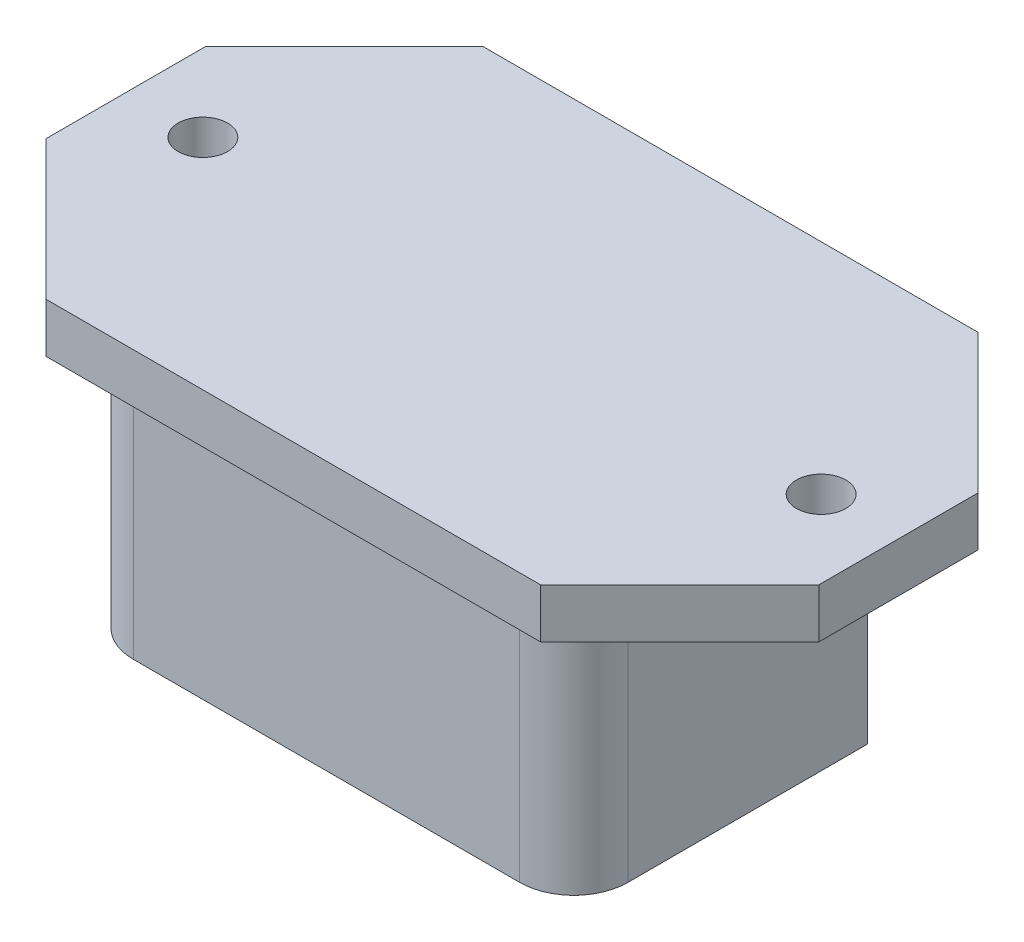
ISO-10303-21;
HEADER;
FILE_DESCRIPTION(('STEP AP214'),'2;1');
FILE_NAME('part.step','',(''),(''),'','','');
FILE_SCHEMA(('AUTOMOTIVE_DESIGN { 1 0 10303 214 1 1 1 1 }'));
ENDSEC;
DATA;
#1=APPLICATION_CONTEXT('core data for automotive mechanical design processes');
#2=APPLICATION_PROTOCOL_DEFINITION('international standard','automotive_design',2000,#1);
#3=PRODUCT_CONTEXT('',#1,'mechanical');
#4=PRODUCT('Part','Part','',(#3));
#5=PRODUCT_RELATED_PRODUCT_CATEGORY('part','',(#4));
#6=PRODUCT_DEFINITION_FORMATION('','',#4);
#7=PRODUCT_DEFINITION_CONTEXT('part definition',#1,'design');
#8=PRODUCT_DEFINITION('design','',#6,#7);
#9=PRODUCT_DEFINITION_SHAPE('','',#8);
#10=(LENGTH_UNIT() NAMED_UNIT(*) SI_UNIT(.MILLI.,.METRE.));
#11=(NAMED_UNIT(*) PLANE_ANGLE_UNIT() SI_UNIT($,.RADIAN.));
#12=(NAMED_UNIT(*) SI_UNIT($,.STERADIAN.) SOLID_ANGLE_UNIT());
#13=UNCERTAINTY_MEASURE_WITH_UNIT(LENGTH_MEASURE(1.E-05),#10,'distance_accuracy_value','');
#14=(GEOMETRIC_REPRESENTATION_CONTEXT(3) GLOBAL_UNCERTAINTY_ASSIGNED_CONTEXT((#13)) GLOBAL_UNIT_ASSIGNED_CONTEXT((#10,
#11,#12)) REPRESENTATION_CONTEXT('',''));
#15=CARTESIAN_POINT('',(0.,0.,0.));
#16=DIRECTION('',(0.,0.,1.));
#17=DIRECTION('',(1.,0.,0.));
#18=AXIS2_PLACEMENT_3D('',#15,#16,#17);
#19=CARTESIAN_POINT('',(16.,16.3,12.));
#20=DIRECTION('',(-1.,0.,0.));
#21=DIRECTION('',(0.,0.,1.));
#22=AXIS2_PLACEMENT_3D('',#19,#20,#21);
#23=PLANE('',#22);
#24=DIRECTION('',(0.,0.,-1.));
#25=VECTOR('',#24,1.);
#26=CARTESIAN_POINT('',(16.,0.,12.));
#27=LINE('',#26,#25);
#28=CARTESIAN_POINT('',(16.,0.,8.5));
#29=VERTEX_POINT('',#28);
#30=CARTESIAN_POINT('',(16.,0.,-6.99999999999998));
#31=VERTEX_POINT('',#30);
#32=EDGE_CURVE('E269',#29,#31,#27,.T.);
#33=ORIENTED_EDGE('',*,*,#32,.T.);
#34=DIRECTION('',(0.,1.,0.));
#35=VECTOR('',#34,1.);
#36=CARTESIAN_POINT('',(16.,16.3,-6.99999999999998));
#37=LINE('',#36,#35);
#38=CARTESIAN_POINT('',(16.,16.3,-6.99999999999998));
#39=VERTEX_POINT('',#38);
#40=EDGE_CURVE('E205',#31,#39,#37,.T.);
#41=ORIENTED_EDGE('',*,*,#40,.T.);
#42=DIRECTION('',(0.,0.,-1.));
#43=VECTOR('',#42,1.);
#44=CARTESIAN_POINT('',(16.,16.3,12.));
#45=LINE('',#44,#43);
#46=CARTESIAN_POINT('',(16.,16.3,8.5));
#47=VERTEX_POINT('',#46);
#48=EDGE_CURVE('E173',#47,#39,#45,.T.);
#49=ORIENTED_EDGE('',*,*,#48,.F.);
#50=DIRECTION('',(0.,-1.,0.));
#51=VECTOR('',#50,1.);
#52=CARTESIAN_POINT('',(16.,16.3,8.5));
#53=LINE('',#52,#51);
#54=EDGE_CURVE('E186',#47,#29,#53,.T.);
#55=ORIENTED_EDGE('',*,*,#54,.T.);
#56=EDGE_LOOP('',(#33,#41,#49,#55));
#57=FACE_BOUND('',#56,.T.);
#58=ADVANCED_FACE('F35',(#57),#23,.F.);
#59=CARTESIAN_POINT('',(-16.,16.3,-12.));
#60=DIRECTION('',(0.,0.,1.));
#61=DIRECTION('',(1.,0.,0.));
#62=AXIS2_PLACEMENT_3D('',#59,#60,#61);
#63=PLANE('',#62);
#64=DIRECTION('',(-1.,0.,0.));
#65=VECTOR('',#64,1.);
#66=CARTESIAN_POINT('',(-16.,0.,-12.));
#67=LINE('',#66,#65);
#68=CARTESIAN_POINT('',(11.,0.,-12.));
#69=VERTEX_POINT('',#68);
#70=CARTESIAN_POINT('',(-11.,0.,-12.));
#71=VERTEX_POINT('',#70);
#72=EDGE_CURVE('E179',#69,#71,#67,.T.);
#73=ORIENTED_EDGE('',*,*,#72,.T.);
#74=DIRECTION('',(0.,1.,0.));
#75=VECTOR('',#74,1.);
#76=CARTESIAN_POINT('',(-11.,16.3,-12.));
#77=LINE('',#76,#75);
#78=CARTESIAN_POINT('',(-11.,16.3,-12.));
#79=VERTEX_POINT('',#78);
#80=EDGE_CURVE('E203',#71,#79,#77,.T.);
#81=ORIENTED_EDGE('',*,*,#80,.T.);
#82=DIRECTION('',(-1.,0.,0.));
#83=VECTOR('',#82,1.);
#84=CARTESIAN_POINT('',(-16.,16.3,-12.));
#85=LINE('',#84,#83);
#86=CARTESIAN_POINT('',(11.,16.3,-12.));
#87=VERTEX_POINT('',#86);
#88=EDGE_CURVE('E177',#87,#79,#85,.T.);
#89=ORIENTED_EDGE('',*,*,#88,.F.);
#90=DIRECTION('',(0.,-1.,0.));
#91=VECTOR('',#90,1.);
#92=CARTESIAN_POINT('',(11.,16.3,-12.));
#93=LINE('',#92,#91);
#94=EDGE_CURVE('E200',#87,#69,#93,.T.);
#95=ORIENTED_EDGE('',*,*,#94,.T.);
#96=EDGE_LOOP('',(#73,#81,#89,#95));
#97=FACE_BOUND('',#96,.T.);
#98=ADVANCED_FACE('F276',(#97),#63,.F.);
#99=CARTESIAN_POINT('',(-16.,16.3,12.));
#100=DIRECTION('',(1.,0.,0.));
#101=DIRECTION('',(0.,0.,-1.));
#102=AXIS2_PLACEMENT_3D('',#99,#100,#101);
#103=PLANE('',#102);
#104=DIRECTION('',(0.,0.,1.));
#105=VECTOR('',#104,1.);
#106=CARTESIAN_POINT('',(-16.,16.3,12.));
#107=LINE('',#106,#105);
#108=CARTESIAN_POINT('',(-16.,16.3,-7.));
#109=VERTEX_POINT('',#108);
#110=CARTESIAN_POINT('',(-16.,16.3,8.5));
#111=VERTEX_POINT('',#110);
#112=EDGE_CURVE('E266',#109,#111,#107,.T.);
#113=ORIENTED_EDGE('',*,*,#112,.F.);
#114=DIRECTION('',(0.,-1.,0.));
#115=VECTOR('',#114,1.);
#116=CARTESIAN_POINT('',(-16.,16.3,-7.));
#117=LINE('',#116,#115);
#118=CARTESIAN_POINT('',(-16.,0.,-7.));
#119=VERTEX_POINT('',#118);
#120=EDGE_CURVE('E193',#109,#119,#117,.T.);
#121=ORIENTED_EDGE('',*,*,#120,.T.);
#122=DIRECTION('',(0.,0.,1.));
#123=VECTOR('',#122,1.);
#124=CARTESIAN_POINT('',(-16.,0.,12.));
#125=LINE('',#124,#123);
#126=CARTESIAN_POINT('',(-16.,0.,8.5));
#127=VERTEX_POINT('',#126);
#128=EDGE_CURVE('E174',#119,#127,#125,.T.);
#129=ORIENTED_EDGE('',*,*,#128,.T.);
#130=DIRECTION('',(0.,-1.,0.));
#131=VECTOR('',#130,1.);
#132=CARTESIAN_POINT('',(-16.,16.3,8.5));
#133=LINE('',#132,#131);
#134=EDGE_CURVE('E155',#127,#111,#133,.F.);
#135=ORIENTED_EDGE('',*,*,#134,.T.);
#136=EDGE_LOOP('',(#113,#121,#129,#135));
#137=FACE_BOUND('',#136,.T.);
#138=ADVANCED_FACE('F285',(#137),#103,.F.);
#139=CARTESIAN_POINT('',(-16.,16.3,12.));
#140=DIRECTION('',(0.,0.,-1.));
#141=DIRECTION('',(-1.,0.,0.));
#142=AXIS2_PLACEMENT_3D('',#139,#140,#141);
#143=PLANE('',#142);
#144=DIRECTION('',(1.,0.,0.));
#145=VECTOR('',#144,1.);
#146=CARTESIAN_POINT('',(-16.,16.3,12.));
#147=LINE('',#146,#145);
#148=CARTESIAN_POINT('',(-12.5,16.3,12.));
#149=VERTEX_POINT('',#148);
#150=CARTESIAN_POINT('',(12.5,16.3,12.));
#151=VERTEX_POINT('',#150);
#152=EDGE_CURVE('E168',#149,#151,#147,.T.);
#153=ORIENTED_EDGE('',*,*,#152,.F.);
#154=DIRECTION('',(0.,-1.,0.));
#155=VECTOR('',#154,1.);
#156=CARTESIAN_POINT('',(-12.5,16.3,12.));
#157=LINE('',#156,#155);
#158=CARTESIAN_POINT('',(-12.5,0.,12.));
#159=VERTEX_POINT('',#158);
#160=EDGE_CURVE('E153',#149,#159,#157,.T.);
#161=ORIENTED_EDGE('',*,*,#160,.T.);
#162=DIRECTION('',(1.,0.,0.));
#163=VECTOR('',#162,1.);
#164=CARTESIAN_POINT('',(-16.,0.,12.));
#165=LINE('',#164,#163);
#166=CARTESIAN_POINT('',(12.5,0.,12.));
#167=VERTEX_POINT('',#166);
#168=EDGE_CURVE('E165',#159,#167,#165,.T.);
#169=ORIENTED_EDGE('',*,*,#168,.T.);
#170=DIRECTION('',(0.,-1.,0.));
#171=VECTOR('',#170,1.);
#172=CARTESIAN_POINT('',(12.5,16.3,12.));
#173=LINE('',#172,#171);
#174=EDGE_CURVE('E169',#167,#151,#173,.F.);
#175=ORIENTED_EDGE('',*,*,#174,.T.);
#176=EDGE_LOOP('',(#153,#161,#169,#175));
#177=FACE_BOUND('',#176,.T.);
#178=ADVANCED_FACE('F164',(#177),#143,.F.);
#179=CARTESIAN_POINT('',(0.,0.,0.));
#180=DIRECTION('',(0.,-1.,0.));
#181=DIRECTION('',(0.,0.,-1.));
#182=AXIS2_PLACEMENT_3D('',#179,#180,#181);
#183=PLANE('',#182);
#184=ORIENTED_EDGE('',*,*,#128,.F.);
#185=DIRECTION('',(-0.707106781186549,0.,0.707106781186546));
#186=VECTOR('',#185,1.);
#187=CARTESIAN_POINT('',(-11.5,0.,-11.5));
#188=LINE('',#187,#186);
#189=EDGE_CURVE('E198',#119,#71,#188,.F.);
#190=ORIENTED_EDGE('',*,*,#189,.T.);
#191=ORIENTED_EDGE('',*,*,#72,.F.);
#192=DIRECTION('',(-0.707106781186546,0.,-0.707106781186549));
#193=VECTOR('',#192,1.);
#194=CARTESIAN_POINT('',(11.5,0.,-11.5));
#195=LINE('',#194,#193);
#196=EDGE_CURVE('E196',#69,#31,#195,.F.);
#197=ORIENTED_EDGE('',*,*,#196,.T.);
#198=ORIENTED_EDGE('',*,*,#32,.F.);
#199=CARTESIAN_POINT('',(12.5,0.,8.5));
#200=DIRECTION('',(0.,-1.,0.));
#201=DIRECTION('',(0.,0.,-1.));
#202=AXIS2_PLACEMENT_3D('',#199,#200,#201);
#203=CIRCLE('',#202,3.5);
#204=EDGE_CURVE('E159',#29,#167,#203,.T.);
#205=ORIENTED_EDGE('',*,*,#204,.T.);
#206=ORIENTED_EDGE('',*,*,#168,.F.);
#207=CARTESIAN_POINT('',(-12.5,0.,8.5));
#208=DIRECTION('',(0.,-1.,0.));
#209=DIRECTION('',(0.,0.,-1.));
#210=AXIS2_PLACEMENT_3D('',#207,#208,#209);
#211=CIRCLE('',#210,3.5);
#212=EDGE_CURVE('E149',#159,#127,#211,.T.);
#213=ORIENTED_EDGE('',*,*,#212,.T.);
#214=EDGE_LOOP('',(#184,#190,#191,#197,#198,#205,#206,#213));
#215=FACE_BOUND('',#214,.T.);
#216=ADVANCED_FACE('F171',(#215),#183,.T.);
#217=CARTESIAN_POINT('',(0.,16.3,0.));
#218=DIRECTION('',(0.,1.,0.));
#219=DIRECTION('',(0.,0.,1.));
#220=AXIS2_PLACEMENT_3D('',#217,#218,#219);
#221=PLANE('',#220);
#222=CARTESIAN_POINT('',(-20.,16.3,0.));
#223=DIRECTION('',(0.,1.,0.));
#224=DIRECTION('',(0.,0.,1.));
#225=AXIS2_PLACEMENT_3D('',#222,#223,#224);
#226=CIRCLE('',#225,1.6);
#227=CARTESIAN_POINT('',(-20.,16.3,1.6));
#228=VERTEX_POINT('',#227);
#229=EDGE_CURVE('E484',#228,#228,#226,.T.);
#230=ORIENTED_EDGE('',*,*,#229,.T.);
#231=EDGE_LOOP('',(#230));
#232=FACE_BOUND('',#231,.T.);
#233=CARTESIAN_POINT('',(20.,16.3,0.));
#234=DIRECTION('',(0.,1.,0.));
#235=DIRECTION('',(0.,0.,-1.));
#236=AXIS2_PLACEMENT_3D('',#233,#234,#235);
#237=CIRCLE('',#236,1.6);
#238=CARTESIAN_POINT('',(20.,16.3,-1.60000000000001));
#239=VERTEX_POINT('',#238);
#240=EDGE_CURVE('E488',#239,#239,#237,.T.);
#241=ORIENTED_EDGE('',*,*,#240,.T.);
#242=EDGE_LOOP('',(#241));
#243=FACE_BOUND('',#242,.T.);
#244=DIRECTION('',(0.,0.,-1.));
#245=VECTOR('',#244,1.);
#246=CARTESIAN_POINT('',(25.,16.3,-14.15));
#247=LINE('',#246,#245);
#248=CARTESIAN_POINT('',(25.,16.3,5.15000000000002));
#249=VERTEX_POINT('',#248);
#250=CARTESIAN_POINT('',(25.,16.3,-5.14999999999997));
#251=VERTEX_POINT('',#250);
#252=EDGE_CURVE('E260',#249,#251,#247,.T.);
#253=ORIENTED_EDGE('',*,*,#252,.F.);
#254=DIRECTION('',(0.707106781186549,0.,-0.707106781186546));
#255=VECTOR('',#254,1.);
#256=CARTESIAN_POINT('',(25.,16.3,5.15000000000002));
#257=LINE('',#256,#255);
#258=CARTESIAN_POINT('',(16.,16.3,14.15));
#259=VERTEX_POINT('',#258);
#260=EDGE_CURVE('E222',#249,#259,#257,.F.);
#261=ORIENTED_EDGE('',*,*,#260,.T.);
#262=DIRECTION('',(1.,0.,0.));
#263=VECTOR('',#262,1.);
#264=CARTESIAN_POINT('',(-25.,16.3,14.15));
#265=LINE('',#264,#263);
#266=CARTESIAN_POINT('',(-16.,16.3,14.15));
#267=VERTEX_POINT('',#266);
#268=EDGE_CURVE('E254',#267,#259,#265,.T.);
#269=ORIENTED_EDGE('',*,*,#268,.F.);
#270=DIRECTION('',(0.707106781186546,0.,0.707106781186549));
#271=VECTOR('',#270,1.);
#272=CARTESIAN_POINT('',(-16.,16.3,14.15));
#273=LINE('',#272,#271);
#274=CARTESIAN_POINT('',(-25.,16.3,5.14999999999997));
#275=VERTEX_POINT('',#274);
#276=EDGE_CURVE('E218',#267,#275,#273,.F.);
#277=ORIENTED_EDGE('',*,*,#276,.T.);
#278=DIRECTION('',(0.,0.,1.));
#279=VECTOR('',#278,1.);
#280=CARTESIAN_POINT('',(-25.,16.3,-14.15));
#281=LINE('',#280,#279);
#282=CARTESIAN_POINT('',(-25.,16.3,-5.15000000000001));
#283=VERTEX_POINT('',#282);
#284=EDGE_CURVE('E244',#283,#275,#281,.T.);
#285=ORIENTED_EDGE('',*,*,#284,.F.);
#286=DIRECTION('',(-0.707106781186549,0.,0.707106781186546));
#287=VECTOR('',#286,1.);
#288=CARTESIAN_POINT('',(-25.,16.3,-5.15000000000001));
#289=LINE('',#288,#287);
#290=CARTESIAN_POINT('',(-16.,16.3,-14.15));
#291=VERTEX_POINT('',#290);
#292=EDGE_CURVE('E216',#283,#291,#289,.F.);
#293=ORIENTED_EDGE('',*,*,#292,.T.);
#294=DIRECTION('',(-1.,0.,0.));
#295=VECTOR('',#294,1.);
#296=CARTESIAN_POINT('',(-25.,16.3,-14.15));
#297=LINE('',#296,#295);
#298=CARTESIAN_POINT('',(16.,16.3,-14.15));
#299=VERTEX_POINT('',#298);
#300=EDGE_CURVE('E255',#299,#291,#297,.T.);
#301=ORIENTED_EDGE('',*,*,#300,.F.);
#302=DIRECTION('',(-0.707106781186546,0.,-0.707106781186549));
#303=VECTOR('',#302,1.);
#304=CARTESIAN_POINT('',(16.,16.3,-14.15));
#305=LINE('',#304,#303);
#306=EDGE_CURVE('E220',#299,#251,#305,.F.);
#307=ORIENTED_EDGE('',*,*,#306,.T.);
#308=EDGE_LOOP('',(#253,#261,#269,#277,#285,#293,#301,#307));
#309=FACE_BOUND('',#308,.T.);
#310=ORIENTED_EDGE('',*,*,#88,.T.);
#311=DIRECTION('',(0.707106781186549,0.,-0.707106781186546));
#312=VECTOR('',#311,1.);
#313=CARTESIAN_POINT('',(-11.5,16.3,-11.5));
#314=LINE('',#313,#312);
#315=EDGE_CURVE('E207',#79,#109,#314,.F.);
#316=ORIENTED_EDGE('',*,*,#315,.T.);
#317=ORIENTED_EDGE('',*,*,#112,.T.);
#318=CARTESIAN_POINT('',(-12.5,16.3,8.5));
#319=DIRECTION('',(0.,1.,0.));
#320=DIRECTION('',(0.,0.,1.));
#321=AXIS2_PLACEMENT_3D('',#318,#319,#320);
#322=CIRCLE('',#321,3.5);
#323=EDGE_CURVE('E189',#111,#149,#322,.T.);
#324=ORIENTED_EDGE('',*,*,#323,.T.);
#325=ORIENTED_EDGE('',*,*,#152,.T.);
#326=CARTESIAN_POINT('',(12.5,16.3,8.5));
#327=DIRECTION('',(0.,1.,0.));
#328=DIRECTION('',(0.,0.,1.));
#329=AXIS2_PLACEMENT_3D('',#326,#327,#328);
#330=CIRCLE('',#329,3.5);
#331=EDGE_CURVE('E191',#151,#47,#330,.T.);
#332=ORIENTED_EDGE('',*,*,#331,.T.);
#333=ORIENTED_EDGE('',*,*,#48,.T.);
#334=DIRECTION('',(0.707106781186546,0.,0.707106781186549));
#335=VECTOR('',#334,1.);
#336=CARTESIAN_POINT('',(11.5,16.3,-11.5));
#337=LINE('',#336,#335);
#338=EDGE_CURVE('E209',#39,#87,#337,.F.);
#339=ORIENTED_EDGE('',*,*,#338,.T.);
#340=EDGE_LOOP('',(#310,#316,#317,#324,#325,#332,#333,#339));
#341=FACE_BOUND('',#340,.T.);
#342=ADVANCED_FACE('F249',(#232,#243,#309,#341),#221,.F.);
#343=CARTESIAN_POINT('',(25.,19.5,-14.15));
#344=DIRECTION('',(-1.,0.,0.));
#345=DIRECTION('',(0.,0.,1.));
#346=AXIS2_PLACEMENT_3D('',#343,#344,#345);
#347=PLANE('',#346);
#348=DIRECTION('',(0.,0.,-1.));
#349=VECTOR('',#348,1.);
#350=CARTESIAN_POINT('',(25.,19.5,-14.15));
#351=LINE('',#350,#349);
#352=CARTESIAN_POINT('',(25.,19.5,5.15000000000002));
#353=VERTEX_POINT('',#352);
#354=CARTESIAN_POINT('',(25.,19.5,-5.14999999999997));
#355=VERTEX_POINT('',#354);
#356=EDGE_CURVE('E258',#353,#355,#351,.T.);
#357=ORIENTED_EDGE('',*,*,#356,.F.);
#358=DIRECTION('',(0.,-1.,0.));
#359=VECTOR('',#358,1.);
#360=CARTESIAN_POINT('',(25.,19.5,5.15000000000002));
#361=LINE('',#360,#359);
#362=EDGE_CURVE('E213',#353,#249,#361,.T.);
#363=ORIENTED_EDGE('',*,*,#362,.T.);
#364=ORIENTED_EDGE('',*,*,#252,.T.);
#365=DIRECTION('',(0.,1.,0.));
#366=VECTOR('',#365,1.);
#367=CARTESIAN_POINT('',(25.,19.5,-5.14999999999997));
#368=LINE('',#367,#366);
#369=EDGE_CURVE('E211',#251,#355,#368,.T.);
#370=ORIENTED_EDGE('',*,*,#369,.T.);
#371=EDGE_LOOP('',(#357,#363,#364,#370));
#372=FACE_BOUND('',#371,.T.);
#373=ADVANCED_FACE('F343',(#372),#347,.F.);
#374=CARTESIAN_POINT('',(-25.,19.5,-14.15));
#375=DIRECTION('',(0.,0.,1.));
#376=DIRECTION('',(1.,0.,0.));
#377=AXIS2_PLACEMENT_3D('',#374,#375,#376);
#378=PLANE('',#377);
#379=DIRECTION('',(-1.,0.,0.));
#380=VECTOR('',#379,1.);
#381=CARTESIAN_POINT('',(-25.,19.5,-14.15));
#382=LINE('',#381,#380);
#383=CARTESIAN_POINT('',(16.,19.5,-14.15));
#384=VERTEX_POINT('',#383);
#385=CARTESIAN_POINT('',(-16.,19.5,-14.15));
#386=VERTEX_POINT('',#385);
#387=EDGE_CURVE('E499',#384,#386,#382,.T.);
#388=ORIENTED_EDGE('',*,*,#387,.F.);
#389=DIRECTION('',(0.,-1.,0.));
#390=VECTOR('',#389,1.);
#391=CARTESIAN_POINT('',(16.,19.5,-14.15));
#392=LINE('',#391,#390);
#393=EDGE_CURVE('E238',#384,#299,#392,.T.);
#394=ORIENTED_EDGE('',*,*,#393,.T.);
#395=ORIENTED_EDGE('',*,*,#300,.T.);
#396=DIRECTION('',(0.,1.,0.));
#397=VECTOR('',#396,1.);
#398=CARTESIAN_POINT('',(-16.,19.5,-14.15));
#399=LINE('',#398,#397);
#400=EDGE_CURVE('E236',#291,#386,#399,.T.);
#401=ORIENTED_EDGE('',*,*,#400,.T.);
#402=EDGE_LOOP('',(#388,#394,#395,#401));
#403=FACE_BOUND('',#402,.T.);
#404=ADVANCED_FACE('F348',(#403),#378,.F.);
#405=CARTESIAN_POINT('',(-25.,19.5,-14.15));
#406=DIRECTION('',(1.,0.,0.));
#407=DIRECTION('',(0.,0.,-1.));
#408=AXIS2_PLACEMENT_3D('',#405,#406,#407);
#409=PLANE('',#408);
#410=ORIENTED_EDGE('',*,*,#284,.T.);
#411=DIRECTION('',(0.,1.,0.));
#412=VECTOR('',#411,1.);
#413=CARTESIAN_POINT('',(-25.,19.5,5.14999999999997));
#414=LINE('',#413,#412);
#415=CARTESIAN_POINT('',(-25.,19.5,5.14999999999997));
#416=VERTEX_POINT('',#415);
#417=EDGE_CURVE('E11',#275,#416,#414,.T.);
#418=ORIENTED_EDGE('',*,*,#417,.T.);
#419=DIRECTION('',(0.,0.,1.));
#420=VECTOR('',#419,1.);
#421=CARTESIAN_POINT('',(-25.,19.5,-14.15));
#422=LINE('',#421,#420);
#423=CARTESIAN_POINT('',(-25.,19.5,-5.15000000000001));
#424=VERTEX_POINT('',#423);
#425=EDGE_CURVE('E245',#424,#416,#422,.T.);
#426=ORIENTED_EDGE('',*,*,#425,.F.);
#427=DIRECTION('',(0.,-1.,0.));
#428=VECTOR('',#427,1.);
#429=CARTESIAN_POINT('',(-25.,19.5,-5.15000000000001));
#430=LINE('',#429,#428);
#431=EDGE_CURVE('E43',#424,#283,#430,.T.);
#432=ORIENTED_EDGE('',*,*,#431,.T.);
#433=EDGE_LOOP('',(#410,#418,#426,#432));
#434=FACE_BOUND('',#433,.T.);
#435=ADVANCED_FACE('F243',(#434),#409,.F.);
#436=CARTESIAN_POINT('',(-25.,19.5,14.15));
#437=DIRECTION('',(0.,0.,-1.));
#438=DIRECTION('',(-1.,0.,0.));
#439=AXIS2_PLACEMENT_3D('',#436,#437,#438);
#440=PLANE('',#439);
#441=ORIENTED_EDGE('',*,*,#268,.T.);
#442=DIRECTION('',(0.,1.,0.));
#443=VECTOR('',#442,1.);
#444=CARTESIAN_POINT('',(16.,19.5,14.15));
#445=LINE('',#444,#443);
#446=CARTESIAN_POINT('',(16.,19.5,14.15));
#447=VERTEX_POINT('',#446);
#448=EDGE_CURVE('E227',#259,#447,#445,.T.);
#449=ORIENTED_EDGE('',*,*,#448,.T.);
#450=DIRECTION('',(1.,0.,0.));
#451=VECTOR('',#450,1.);
#452=CARTESIAN_POINT('',(-25.,19.5,14.15));
#453=LINE('',#452,#451);
#454=CARTESIAN_POINT('',(-16.,19.5,14.15));
#455=VERTEX_POINT('',#454);
#456=EDGE_CURVE('E271',#455,#447,#453,.T.);
#457=ORIENTED_EDGE('',*,*,#456,.F.);
#458=DIRECTION('',(0.,-1.,0.));
#459=VECTOR('',#458,1.);
#460=CARTESIAN_POINT('',(-16.,19.5,14.15));
#461=LINE('',#460,#459);
#462=EDGE_CURVE('E224',#455,#267,#461,.T.);
#463=ORIENTED_EDGE('',*,*,#462,.T.);
#464=EDGE_LOOP('',(#441,#449,#457,#463));
#465=FACE_BOUND('',#464,.T.);
#466=ADVANCED_FACE('F369',(#465),#440,.F.);
#467=CARTESIAN_POINT('',(0.,19.5,0.));
#468=DIRECTION('',(0.,1.,0.));
#469=DIRECTION('',(0.,0.,1.));
#470=AXIS2_PLACEMENT_3D('',#467,#468,#469);
#471=PLANE('',#470);
#472=CARTESIAN_POINT('',(-20.,19.5,0.));
#473=DIRECTION('',(0.,1.,0.));
#474=DIRECTION('',(0.,0.,1.));
#475=AXIS2_PLACEMENT_3D('',#472,#473,#474);
#476=CIRCLE('',#475,1.6);
#477=CARTESIAN_POINT('',(-20.,19.5,1.6));
#478=VERTEX_POINT('',#477);
#479=EDGE_CURVE('E487',#478,#478,#476,.T.);
#480=ORIENTED_EDGE('',*,*,#479,.F.);
#481=EDGE_LOOP('',(#480));
#482=FACE_BOUND('',#481,.T.);
#483=CARTESIAN_POINT('',(20.,19.5,0.));
#484=DIRECTION('',(0.,1.,0.));
#485=DIRECTION('',(0.,0.,-1.));
#486=AXIS2_PLACEMENT_3D('',#483,#484,#485);
#487=CIRCLE('',#486,1.6);
#488=CARTESIAN_POINT('',(20.,19.5,-1.60000000000001));
#489=VERTEX_POINT('',#488);
#490=EDGE_CURVE('E492',#489,#489,#487,.T.);
#491=ORIENTED_EDGE('',*,*,#490,.F.);
#492=EDGE_LOOP('',(#491));
#493=FACE_BOUND('',#492,.T.);
#494=ORIENTED_EDGE('',*,*,#456,.T.);
#495=DIRECTION('',(-0.707106781186549,0.,0.707106781186546));
#496=VECTOR('',#495,1.);
#497=CARTESIAN_POINT('',(15.075,19.5,15.075));
#498=LINE('',#497,#496);
#499=EDGE_CURVE('E234',#447,#353,#498,.F.);
#500=ORIENTED_EDGE('',*,*,#499,.T.);
#501=ORIENTED_EDGE('',*,*,#356,.T.);
#502=DIRECTION('',(0.707106781186546,0.,0.707106781186549));
#503=VECTOR('',#502,1.);
#504=CARTESIAN_POINT('',(15.075,19.5,-15.075));
#505=LINE('',#504,#503);
#506=EDGE_CURVE('E232',#355,#384,#505,.F.);
#507=ORIENTED_EDGE('',*,*,#506,.T.);
#508=ORIENTED_EDGE('',*,*,#387,.T.);
#509=DIRECTION('',(0.707106781186549,0.,-0.707106781186546));
#510=VECTOR('',#509,1.);
#511=CARTESIAN_POINT('',(-15.075,19.5,-15.075));
#512=LINE('',#511,#510);
#513=EDGE_CURVE('E55',#386,#424,#512,.F.);
#514=ORIENTED_EDGE('',*,*,#513,.T.);
#515=ORIENTED_EDGE('',*,*,#425,.T.);
#516=DIRECTION('',(-0.707106781186546,0.,-0.707106781186549));
#517=VECTOR('',#516,1.);
#518=CARTESIAN_POINT('',(-15.075,19.5,15.075));
#519=LINE('',#518,#517);
#520=EDGE_CURVE('E230',#416,#455,#519,.F.);
#521=ORIENTED_EDGE('',*,*,#520,.T.);
#522=EDGE_LOOP('',(#494,#500,#501,#507,#508,#514,#515,#521));
#523=FACE_BOUND('',#522,.T.);
#524=ADVANCED_FACE('F317',(#482,#493,#523),#471,.T.);
#525=CARTESIAN_POINT('',(-12.5,16.3,8.5));
#526=DIRECTION('',(0.,-1.,0.));
#527=DIRECTION('',(0.,0.,-1.));
#528=AXIS2_PLACEMENT_3D('',#525,#526,#527);
#529=CYLINDRICAL_SURFACE('',#528,3.5);
#530=ORIENTED_EDGE('',*,*,#323,.F.);
#531=ORIENTED_EDGE('',*,*,#134,.F.);
#532=ORIENTED_EDGE('',*,*,#212,.F.);
#533=ORIENTED_EDGE('',*,*,#160,.F.);
#534=EDGE_LOOP('',(#530,#531,#532,#533));
#535=FACE_BOUND('',#534,.T.);
#536=ADVANCED_FACE('F152',(#535),#529,.T.);
#537=CARTESIAN_POINT('',(12.5,16.3,8.5));
#538=DIRECTION('',(0.,-1.,0.));
#539=DIRECTION('',(0.,0.,-1.));
#540=AXIS2_PLACEMENT_3D('',#537,#538,#539);
#541=CYLINDRICAL_SURFACE('',#540,3.5);
#542=ORIENTED_EDGE('',*,*,#331,.F.);
#543=ORIENTED_EDGE('',*,*,#174,.F.);
#544=ORIENTED_EDGE('',*,*,#204,.F.);
#545=ORIENTED_EDGE('',*,*,#54,.F.);
#546=EDGE_LOOP('',(#542,#543,#544,#545));
#547=FACE_BOUND('',#546,.T.);
#548=ADVANCED_FACE('F290',(#547),#541,.T.);
#549=CARTESIAN_POINT('',(-16.,16.3,-7.));
#550=DIRECTION('',(0.707106781186546,0.,0.707106781186549));
#551=DIRECTION('',(0.,-1.,0.));
#552=AXIS2_PLACEMENT_3D('',#549,#550,#551);
#553=PLANE('',#552);
#554=ORIENTED_EDGE('',*,*,#315,.F.);
#555=ORIENTED_EDGE('',*,*,#80,.F.);
#556=ORIENTED_EDGE('',*,*,#189,.F.);
#557=ORIENTED_EDGE('',*,*,#120,.F.);
#558=EDGE_LOOP('',(#554,#555,#556,#557));
#559=FACE_BOUND('',#558,.T.);
#560=ADVANCED_FACE('F281',(#559),#553,.F.);
#561=CARTESIAN_POINT('',(11.,16.3,-12.));
#562=DIRECTION('',(-0.707106781186549,0.,0.707106781186546));
#563=DIRECTION('',(0.,-1.,0.));
#564=AXIS2_PLACEMENT_3D('',#561,#562,#563);
#565=PLANE('',#564);
#566=ORIENTED_EDGE('',*,*,#338,.F.);
#567=ORIENTED_EDGE('',*,*,#40,.F.);
#568=ORIENTED_EDGE('',*,*,#196,.F.);
#569=ORIENTED_EDGE('',*,*,#94,.F.);
#570=EDGE_LOOP('',(#566,#567,#568,#569));
#571=FACE_BOUND('',#570,.T.);
#572=ADVANCED_FACE('F295',(#571),#565,.F.);
#573=CARTESIAN_POINT('',(25.,19.5,5.15000000000002));
#574=DIRECTION('',(-0.707106781186546,0.,-0.707106781186549));
#575=DIRECTION('',(0.,-1.,0.));
#576=AXIS2_PLACEMENT_3D('',#573,#574,#575);
#577=PLANE('',#576);
#578=ORIENTED_EDGE('',*,*,#499,.F.);
#579=ORIENTED_EDGE('',*,*,#448,.F.);
#580=ORIENTED_EDGE('',*,*,#260,.F.);
#581=ORIENTED_EDGE('',*,*,#362,.F.);
#582=EDGE_LOOP('',(#578,#579,#580,#581));
#583=FACE_BOUND('',#582,.T.);
#584=ADVANCED_FACE('F297',(#583),#577,.F.);
#585=CARTESIAN_POINT('',(16.,19.5,-14.15));
#586=DIRECTION('',(-0.707106781186549,0.,0.707106781186546));
#587=DIRECTION('',(0.,-1.,0.));
#588=AXIS2_PLACEMENT_3D('',#585,#586,#587);
#589=PLANE('',#588);
#590=ORIENTED_EDGE('',*,*,#506,.F.);
#591=ORIENTED_EDGE('',*,*,#369,.F.);
#592=ORIENTED_EDGE('',*,*,#306,.F.);
#593=ORIENTED_EDGE('',*,*,#393,.F.);
#594=EDGE_LOOP('',(#590,#591,#592,#593));
#595=FACE_BOUND('',#594,.T.);
#596=ADVANCED_FACE('F303',(#595),#589,.F.);
#597=CARTESIAN_POINT('',(-16.,19.5,14.15));
#598=DIRECTION('',(0.707106781186549,0.,-0.707106781186546));
#599=DIRECTION('',(0.,-1.,0.));
#600=AXIS2_PLACEMENT_3D('',#597,#598,#599);
#601=PLANE('',#600);
#602=ORIENTED_EDGE('',*,*,#520,.F.);
#603=ORIENTED_EDGE('',*,*,#417,.F.);
#604=ORIENTED_EDGE('',*,*,#276,.F.);
#605=ORIENTED_EDGE('',*,*,#462,.F.);
#606=EDGE_LOOP('',(#602,#603,#604,#605));
#607=FACE_BOUND('',#606,.T.);
#608=ADVANCED_FACE('F393',(#607),#601,.F.);
#609=CARTESIAN_POINT('',(-25.,19.5,-5.15000000000001));
#610=DIRECTION('',(0.707106781186546,0.,0.707106781186549));
#611=DIRECTION('',(0.,-1.,0.));
#612=AXIS2_PLACEMENT_3D('',#609,#610,#611);
#613=PLANE('',#612);
#614=ORIENTED_EDGE('',*,*,#513,.F.);
#615=ORIENTED_EDGE('',*,*,#400,.F.);
#616=ORIENTED_EDGE('',*,*,#292,.F.);
#617=ORIENTED_EDGE('',*,*,#431,.F.);
#618=EDGE_LOOP('',(#614,#615,#616,#617));
#619=FACE_BOUND('',#618,.T.);
#620=ADVANCED_FACE('F37',(#619),#613,.F.);
#621=CARTESIAN_POINT('',(20.,16.3,0.));
#622=DIRECTION('',(0.,1.,0.));
#623=DIRECTION('',(0.,0.,1.));
#624=AXIS2_PLACEMENT_3D('',#621,#622,#623);
#625=CYLINDRICAL_SURFACE('',#624,1.6);
#626=ORIENTED_EDGE('',*,*,#240,.F.);
#627=EDGE_LOOP('',(#626));
#628=FACE_BOUND('',#627,.T.);
#629=ORIENTED_EDGE('',*,*,#490,.T.);
#630=EDGE_LOOP('',(#629));
#631=FACE_BOUND('',#630,.T.);
#632=ADVANCED_FACE('F411',(#628,#631),#625,.F.);
#633=CARTESIAN_POINT('',(-20.,16.3,0.));
#634=DIRECTION('',(0.,1.,0.));
#635=DIRECTION('',(0.,0.,1.));
#636=AXIS2_PLACEMENT_3D('',#633,#634,#635);
#637=CYLINDRICAL_SURFACE('',#636,1.6);
#638=ORIENTED_EDGE('',*,*,#229,.F.);
#639=EDGE_LOOP('',(#638));
#640=FACE_BOUND('',#639,.T.);
#641=ORIENTED_EDGE('',*,*,#479,.T.);
#642=EDGE_LOOP('',(#641));
#643=FACE_BOUND('',#642,.T.);
#644=ADVANCED_FACE('F434',(#640,#643),#637,.F.);
#645=CLOSED_SHELL('',(#58,#98,#138,#178,#216,#342,#373,#404,#435,#466,#524,#536,#548,#560,#572,
#584,#596,#608,#620,#632,#644));
#646=MANIFOLD_SOLID_BREP('B2',#645);
#647=ADVANCED_BREP_SHAPE_REPRESENTATION('',(#18,#646),#14);
#648=SHAPE_DEFINITION_REPRESENTATION(#9,#647);
ENDSEC;
END-ISO-10303-21;
